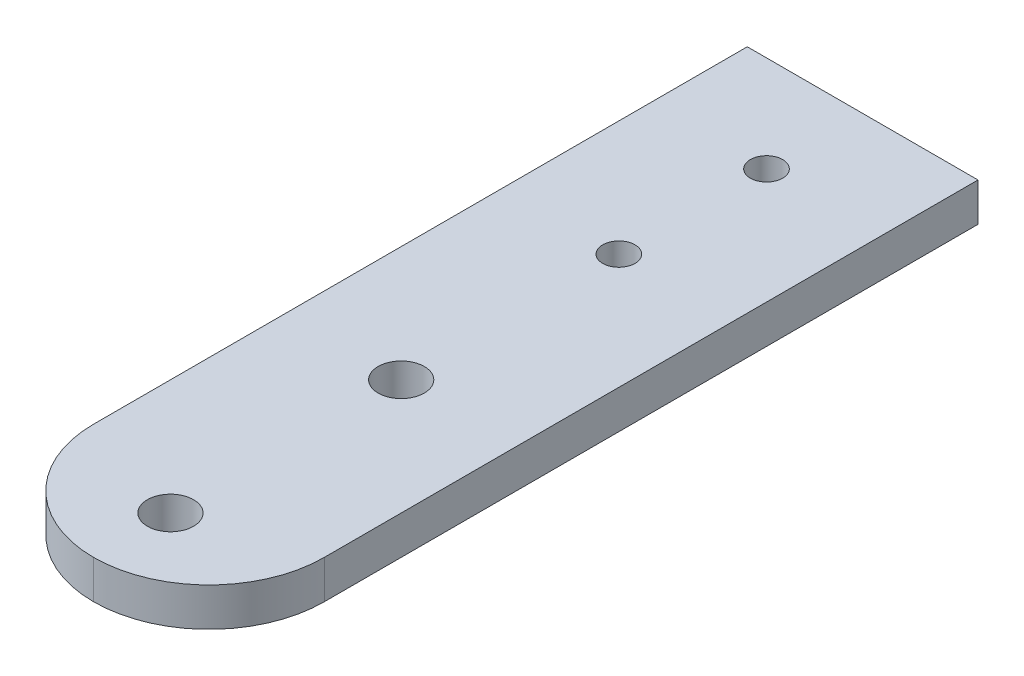
ISO-10303-21;
HEADER;
FILE_DESCRIPTION(('STEP AP214'),'2;1');
FILE_NAME('part.step','',(''),(''),'','','');
FILE_SCHEMA(('AUTOMOTIVE_DESIGN { 1 0 10303 214 1 1 1 1 }'));
ENDSEC;
DATA;
#1=APPLICATION_CONTEXT('core data for automotive mechanical design processes');
#2=APPLICATION_PROTOCOL_DEFINITION('international standard','automotive_design',2000,#1);
#3=PRODUCT_CONTEXT('',#1,'mechanical');
#4=PRODUCT('Part','Part','',(#3));
#5=PRODUCT_RELATED_PRODUCT_CATEGORY('part','',(#4));
#6=PRODUCT_DEFINITION_FORMATION('','',#4);
#7=PRODUCT_DEFINITION_CONTEXT('part definition',#1,'design');
#8=PRODUCT_DEFINITION('design','',#6,#7);
#9=PRODUCT_DEFINITION_SHAPE('','',#8);
#10=(LENGTH_UNIT() NAMED_UNIT(*) SI_UNIT(.MILLI.,.METRE.));
#11=(NAMED_UNIT(*) PLANE_ANGLE_UNIT() SI_UNIT($,.RADIAN.));
#12=(NAMED_UNIT(*) SI_UNIT($,.STERADIAN.) SOLID_ANGLE_UNIT());
#13=UNCERTAINTY_MEASURE_WITH_UNIT(LENGTH_MEASURE(1.E-05),#10,'distance_accuracy_value','');
#14=(GEOMETRIC_REPRESENTATION_CONTEXT(3) GLOBAL_UNCERTAINTY_ASSIGNED_CONTEXT((#13)) GLOBAL_UNIT_ASSIGNED_CONTEXT((#10,
#11,#12)) REPRESENTATION_CONTEXT('',''));
#15=CARTESIAN_POINT('',(0.,0.,0.));
#16=DIRECTION('',(0.,0.,1.));
#17=DIRECTION('',(1.,0.,0.));
#18=AXIS2_PLACEMENT_3D('',#15,#16,#17);
#19=CARTESIAN_POINT('',(7.50000000000002,-1.25,50.));
#20=DIRECTION('',(-1.,0.,0.));
#21=DIRECTION('',(0.,0.,1.));
#22=AXIS2_PLACEMENT_3D('',#19,#20,#21);
#23=PLANE('',#22);
#24=DIRECTION('',(0.,0.,-1.));
#25=VECTOR('',#24,1.);
#26=CARTESIAN_POINT('',(7.50000000000002,1.25,50.));
#27=LINE('',#26,#25);
#28=CARTESIAN_POINT('',(7.50000000000002,1.25,42.5));
#29=VERTEX_POINT('',#28);
#30=CARTESIAN_POINT('',(7.50000000000002,1.25,0.));
#31=VERTEX_POINT('',#30);
#32=EDGE_CURVE('E74',#29,#31,#27,.T.);
#33=ORIENTED_EDGE('',*,*,#32,.F.);
#34=DIRECTION('',(0.,1.,0.));
#35=VECTOR('',#34,1.);
#36=CARTESIAN_POINT('',(7.50000000000002,-1.25,42.5));
#37=LINE('',#36,#35);
#38=CARTESIAN_POINT('',(7.50000000000002,-1.25,42.5));
#39=VERTEX_POINT('',#38);
#40=EDGE_CURVE('E11',#29,#39,#37,.F.);
#41=ORIENTED_EDGE('',*,*,#40,.T.);
#42=DIRECTION('',(0.,0.,-1.));
#43=VECTOR('',#42,1.);
#44=CARTESIAN_POINT('',(7.50000000000002,-1.25,50.));
#45=LINE('',#44,#43);
#46=CARTESIAN_POINT('',(7.50000000000002,-1.25,0.));
#47=VERTEX_POINT('',#46);
#48=EDGE_CURVE('E94',#39,#47,#45,.T.);
#49=ORIENTED_EDGE('',*,*,#48,.T.);
#50=DIRECTION('',(0.,1.,0.));
#51=VECTOR('',#50,1.);
#52=CARTESIAN_POINT('',(7.50000000000002,-1.25,0.));
#53=LINE('',#52,#51);
#54=EDGE_CURVE('E89',#47,#31,#53,.T.);
#55=ORIENTED_EDGE('',*,*,#54,.T.);
#56=EDGE_LOOP('',(#33,#41,#49,#55));
#57=FACE_BOUND('',#56,.T.);
#58=ADVANCED_FACE('F31',(#57),#23,.F.);
#59=CARTESIAN_POINT('',(-7.49999999999998,1.25,50.));
#60=DIRECTION('',(0.,-1.,0.));
#61=DIRECTION('',(0.,0.,-1.));
#62=AXIS2_PLACEMENT_3D('',#59,#60,#61);
#63=PLANE('',#62);
#64=CARTESIAN_POINT('',(0.,1.25,15.8495694215464));
#65=DIRECTION('',(0.,1.,0.));
#66=DIRECTION('',(0.,0.,1.));
#67=AXIS2_PLACEMENT_3D('',#64,#65,#66);
#68=CIRCLE('',#67,1.05);
#69=CARTESIAN_POINT('',(0.,1.25,16.8995694215464));
#70=VERTEX_POINT('',#69);
#71=EDGE_CURVE('E131',#70,#70,#68,.T.);
#72=ORIENTED_EDGE('',*,*,#71,.F.);
#73=EDGE_LOOP('',(#72));
#74=FACE_BOUND('',#73,.T.);
#75=CARTESIAN_POINT('',(0.,1.25,6.24956942154637));
#76=DIRECTION('',(0.,1.,0.));
#77=DIRECTION('',(0.,0.,1.));
#78=AXIS2_PLACEMENT_3D('',#75,#76,#77);
#79=CIRCLE('',#78,1.05);
#80=CARTESIAN_POINT('',(0.,1.25,7.29956942154637));
#81=VERTEX_POINT('',#80);
#82=EDGE_CURVE('E123',#81,#81,#79,.T.);
#83=ORIENTED_EDGE('',*,*,#82,.F.);
#84=EDGE_LOOP('',(#83));
#85=FACE_BOUND('',#84,.T.);
#86=CARTESIAN_POINT('',(0.,1.25,30.));
#87=DIRECTION('',(0.,1.,0.));
#88=DIRECTION('',(0.,0.,1.));
#89=AXIS2_PLACEMENT_3D('',#86,#87,#88);
#90=CIRCLE('',#89,1.5);
#91=CARTESIAN_POINT('',(0.,1.25,31.5));
#92=VERTEX_POINT('',#91);
#93=EDGE_CURVE('E120',#92,#92,#90,.T.);
#94=ORIENTED_EDGE('',*,*,#93,.F.);
#95=EDGE_LOOP('',(#94));
#96=FACE_BOUND('',#95,.T.);
#97=CARTESIAN_POINT('',(0.,1.25,45.));
#98=DIRECTION('',(0.,1.,0.));
#99=DIRECTION('',(0.,0.,1.));
#100=AXIS2_PLACEMENT_3D('',#97,#98,#99);
#101=CIRCLE('',#100,1.5);
#102=CARTESIAN_POINT('',(0.,1.25,46.5));
#103=VERTEX_POINT('',#102);
#104=EDGE_CURVE('E99',#103,#103,#101,.T.);
#105=ORIENTED_EDGE('',*,*,#104,.F.);
#106=EDGE_LOOP('',(#105));
#107=FACE_BOUND('',#106,.T.);
#108=DIRECTION('',(0.,0.,-1.));
#109=VECTOR('',#108,1.);
#110=CARTESIAN_POINT('',(-7.49999999999998,1.25,50.));
#111=LINE('',#110,#109);
#112=CARTESIAN_POINT('',(-7.49999999999998,1.25,42.5));
#113=VERTEX_POINT('',#112);
#114=CARTESIAN_POINT('',(-7.49999999999998,1.25,0.));
#115=VERTEX_POINT('',#114);
#116=EDGE_CURVE('E83',#113,#115,#111,.T.);
#117=ORIENTED_EDGE('',*,*,#116,.F.);
#118=CARTESIAN_POINT('',(0.,1.25,42.5));
#119=DIRECTION('',(0.,-1.,0.));
#120=DIRECTION('',(0.,0.,-1.));
#121=AXIS2_PLACEMENT_3D('',#118,#119,#120);
#122=CIRCLE('',#121,7.5);
#123=CARTESIAN_POINT('',(0.,1.25,50.));
#124=VERTEX_POINT('',#123);
#125=EDGE_CURVE('E40',#113,#124,#122,.F.);
#126=ORIENTED_EDGE('',*,*,#125,.T.);
#127=CARTESIAN_POINT('',(0.,1.25,42.5));
#128=DIRECTION('',(0.,-1.,0.));
#129=DIRECTION('',(0.,0.,-1.));
#130=AXIS2_PLACEMENT_3D('',#127,#128,#129);
#131=CIRCLE('',#130,7.5);
#132=EDGE_CURVE('E48',#124,#29,#131,.F.);
#133=ORIENTED_EDGE('',*,*,#132,.T.);
#134=ORIENTED_EDGE('',*,*,#32,.T.);
#135=DIRECTION('',(-1.,0.,0.));
#136=VECTOR('',#135,1.);
#137=CARTESIAN_POINT('',(-7.49999999999998,1.25,0.));
#138=LINE('',#137,#136);
#139=EDGE_CURVE('E77',#31,#115,#138,.T.);
#140=ORIENTED_EDGE('',*,*,#139,.T.);
#141=EDGE_LOOP('',(#117,#126,#133,#134,#140));
#142=FACE_BOUND('',#141,.T.);
#143=ADVANCED_FACE('F76',(#74,#85,#96,#107,#142),#63,.F.);
#144=CARTESIAN_POINT('',(-7.49999999999998,-1.25,50.));
#145=DIRECTION('',(1.,0.,0.));
#146=DIRECTION('',(0.,0.,-1.));
#147=AXIS2_PLACEMENT_3D('',#144,#145,#146);
#148=PLANE('',#147);
#149=DIRECTION('',(0.,0.,-1.));
#150=VECTOR('',#149,1.);
#151=CARTESIAN_POINT('',(-7.49999999999998,-1.25,50.));
#152=LINE('',#151,#150);
#153=CARTESIAN_POINT('',(-7.49999999999998,-1.25,42.5));
#154=VERTEX_POINT('',#153);
#155=CARTESIAN_POINT('',(-7.49999999999998,-1.25,0.));
#156=VERTEX_POINT('',#155);
#157=EDGE_CURVE('E107',#154,#156,#152,.T.);
#158=ORIENTED_EDGE('',*,*,#157,.F.);
#159=DIRECTION('',(0.,-1.,0.));
#160=VECTOR('',#159,1.);
#161=CARTESIAN_POINT('',(-7.49999999999998,-1.25,42.5));
#162=LINE('',#161,#160);
#163=EDGE_CURVE('E113',#154,#113,#162,.F.);
#164=ORIENTED_EDGE('',*,*,#163,.T.);
#165=ORIENTED_EDGE('',*,*,#116,.T.);
#166=DIRECTION('',(0.,-1.,0.));
#167=VECTOR('',#166,1.);
#168=CARTESIAN_POINT('',(-7.49999999999998,-1.25,0.));
#169=LINE('',#168,#167);
#170=EDGE_CURVE('E91',#115,#156,#169,.T.);
#171=ORIENTED_EDGE('',*,*,#170,.T.);
#172=EDGE_LOOP('',(#158,#164,#165,#171));
#173=FACE_BOUND('',#172,.T.);
#174=ADVANCED_FACE('F144',(#173),#148,.F.);
#175=CARTESIAN_POINT('',(-7.49999999999998,-1.25,50.));
#176=DIRECTION('',(0.,1.,0.));
#177=DIRECTION('',(0.,0.,1.));
#178=AXIS2_PLACEMENT_3D('',#175,#176,#177);
#179=PLANE('',#178);
#180=CARTESIAN_POINT('',(0.,-1.25,15.8495694215464));
#181=DIRECTION('',(0.,1.,0.));
#182=DIRECTION('',(0.,0.,1.));
#183=AXIS2_PLACEMENT_3D('',#180,#181,#182);
#184=CIRCLE('',#183,1.05);
#185=CARTESIAN_POINT('',(0.,-1.25,16.8995694215464));
#186=VERTEX_POINT('',#185);
#187=EDGE_CURVE('E35',#186,#186,#184,.T.);
#188=ORIENTED_EDGE('',*,*,#187,.T.);
#189=EDGE_LOOP('',(#188));
#190=FACE_BOUND('',#189,.T.);
#191=CARTESIAN_POINT('',(0.,-1.25,6.24956942154637));
#192=DIRECTION('',(0.,1.,0.));
#193=DIRECTION('',(0.,0.,1.));
#194=AXIS2_PLACEMENT_3D('',#191,#192,#193);
#195=CIRCLE('',#194,1.05);
#196=CARTESIAN_POINT('',(0.,-1.25,7.29956942154637));
#197=VERTEX_POINT('',#196);
#198=EDGE_CURVE('E121',#197,#197,#195,.T.);
#199=ORIENTED_EDGE('',*,*,#198,.T.);
#200=EDGE_LOOP('',(#199));
#201=FACE_BOUND('',#200,.T.);
#202=CARTESIAN_POINT('',(0.,-1.25,30.));
#203=DIRECTION('',(0.,1.,0.));
#204=DIRECTION('',(0.,0.,1.));
#205=AXIS2_PLACEMENT_3D('',#202,#203,#204);
#206=CIRCLE('',#205,1.5);
#207=CARTESIAN_POINT('',(0.,-1.25,31.5));
#208=VERTEX_POINT('',#207);
#209=EDGE_CURVE('E134',#208,#208,#206,.T.);
#210=ORIENTED_EDGE('',*,*,#209,.T.);
#211=EDGE_LOOP('',(#210));
#212=FACE_BOUND('',#211,.T.);
#213=CARTESIAN_POINT('',(0.,-1.25,45.));
#214=DIRECTION('',(0.,1.,0.));
#215=DIRECTION('',(0.,0.,1.));
#216=AXIS2_PLACEMENT_3D('',#213,#214,#215);
#217=CIRCLE('',#216,1.5);
#218=CARTESIAN_POINT('',(0.,-1.25,46.5));
#219=VERTEX_POINT('',#218);
#220=EDGE_CURVE('E96',#219,#219,#217,.T.);
#221=ORIENTED_EDGE('',*,*,#220,.T.);
#222=EDGE_LOOP('',(#221));
#223=FACE_BOUND('',#222,.T.);
#224=CARTESIAN_POINT('',(0.,-1.25,42.5));
#225=DIRECTION('',(0.,1.,0.));
#226=DIRECTION('',(0.,0.,1.));
#227=AXIS2_PLACEMENT_3D('',#224,#225,#226);
#228=CIRCLE('',#227,7.5);
#229=CARTESIAN_POINT('',(0.,-1.25,50.));
#230=VERTEX_POINT('',#229);
#231=EDGE_CURVE('E82',#39,#230,#228,.F.);
#232=ORIENTED_EDGE('',*,*,#231,.T.);
#233=CARTESIAN_POINT('',(0.,-1.25,42.5));
#234=DIRECTION('',(0.,1.,0.));
#235=DIRECTION('',(0.,0.,1.));
#236=AXIS2_PLACEMENT_3D('',#233,#234,#235);
#237=CIRCLE('',#236,7.5);
#238=EDGE_CURVE('E111',#230,#154,#237,.F.);
#239=ORIENTED_EDGE('',*,*,#238,.T.);
#240=ORIENTED_EDGE('',*,*,#157,.T.);
#241=DIRECTION('',(1.,0.,0.));
#242=VECTOR('',#241,1.);
#243=CARTESIAN_POINT('',(-7.49999999999998,-1.25,0.));
#244=LINE('',#243,#242);
#245=EDGE_CURVE('E104',#156,#47,#244,.T.);
#246=ORIENTED_EDGE('',*,*,#245,.T.);
#247=ORIENTED_EDGE('',*,*,#48,.F.);
#248=EDGE_LOOP('',(#232,#239,#240,#246,#247));
#249=FACE_BOUND('',#248,.T.);
#250=ADVANCED_FACE('F160',(#190,#201,#212,#223,#249),#179,.F.);
#251=CARTESIAN_POINT('',(7.50000000000002,1.25,0.));
#252=DIRECTION('',(0.,0.,-1.));
#253=DIRECTION('',(-1.,0.,0.));
#254=AXIS2_PLACEMENT_3D('',#251,#252,#253);
#255=PLANE('',#254);
#256=ORIENTED_EDGE('',*,*,#54,.F.);
#257=ORIENTED_EDGE('',*,*,#245,.F.);
#258=ORIENTED_EDGE('',*,*,#170,.F.);
#259=ORIENTED_EDGE('',*,*,#139,.F.);
#260=EDGE_LOOP('',(#256,#257,#258,#259));
#261=FACE_BOUND('',#260,.T.);
#262=ADVANCED_FACE('F87',(#261),#255,.T.);
#263=CARTESIAN_POINT('',(0.,-1.25,45.));
#264=DIRECTION('',(0.,1.,0.));
#265=DIRECTION('',(0.,0.,1.));
#266=AXIS2_PLACEMENT_3D('',#263,#264,#265);
#267=CYLINDRICAL_SURFACE('',#266,1.5);
#268=ORIENTED_EDGE('',*,*,#220,.F.);
#269=EDGE_LOOP('',(#268));
#270=FACE_BOUND('',#269,.T.);
#271=ORIENTED_EDGE('',*,*,#104,.T.);
#272=EDGE_LOOP('',(#271));
#273=FACE_BOUND('',#272,.T.);
#274=ADVANCED_FACE('F150',(#270,#273),#267,.F.);
#275=CARTESIAN_POINT('',(0.,-1.25,30.));
#276=DIRECTION('',(0.,1.,0.));
#277=DIRECTION('',(0.,0.,1.));
#278=AXIS2_PLACEMENT_3D('',#275,#276,#277);
#279=CYLINDRICAL_SURFACE('',#278,1.5);
#280=ORIENTED_EDGE('',*,*,#209,.F.);
#281=EDGE_LOOP('',(#280));
#282=FACE_BOUND('',#281,.T.);
#283=ORIENTED_EDGE('',*,*,#93,.T.);
#284=EDGE_LOOP('',(#283));
#285=FACE_BOUND('',#284,.T.);
#286=ADVANCED_FACE('F140',(#282,#285),#279,.F.);
#287=CARTESIAN_POINT('',(0.,1.25,42.5));
#288=DIRECTION('',(0.,1.,0.));
#289=DIRECTION('',(0.,0.,1.));
#290=AXIS2_PLACEMENT_3D('',#287,#288,#289);
#291=CYLINDRICAL_SURFACE('',#290,7.5);
#292=ORIENTED_EDGE('',*,*,#40,.F.);
#293=ORIENTED_EDGE('',*,*,#132,.F.);
#294=DIRECTION('',(0.,1.,0.));
#295=VECTOR('',#294,1.);
#296=CARTESIAN_POINT('',(0.,1.25,50.));
#297=LINE('',#296,#295);
#298=EDGE_CURVE('E118',#230,#124,#297,.T.);
#299=ORIENTED_EDGE('',*,*,#298,.F.);
#300=ORIENTED_EDGE('',*,*,#231,.F.);
#301=EDGE_LOOP('',(#292,#293,#299,#300));
#302=FACE_BOUND('',#301,.T.);
#303=ADVANCED_FACE('F33',(#302),#291,.T.);
#304=CARTESIAN_POINT('',(0.,1.25,42.5));
#305=DIRECTION('',(0.,-1.,0.));
#306=DIRECTION('',(0.,0.,-1.));
#307=AXIS2_PLACEMENT_3D('',#304,#305,#306);
#308=CYLINDRICAL_SURFACE('',#307,7.5);
#309=ORIENTED_EDGE('',*,*,#125,.F.);
#310=ORIENTED_EDGE('',*,*,#163,.F.);
#311=ORIENTED_EDGE('',*,*,#238,.F.);
#312=ORIENTED_EDGE('',*,*,#298,.T.);
#313=EDGE_LOOP('',(#309,#310,#311,#312));
#314=FACE_BOUND('',#313,.T.);
#315=ADVANCED_FACE('F168',(#314),#308,.T.);
#316=CARTESIAN_POINT('',(0.,-8.75,6.24956942154637));
#317=DIRECTION('',(0.,1.,0.));
#318=DIRECTION('',(0.,0.,1.));
#319=AXIS2_PLACEMENT_3D('',#316,#317,#318);
#320=CYLINDRICAL_SURFACE('',#319,1.05);
#321=ORIENTED_EDGE('',*,*,#82,.T.);
#322=EDGE_LOOP('',(#321));
#323=FACE_BOUND('',#322,.T.);
#324=ORIENTED_EDGE('',*,*,#198,.F.);
#325=EDGE_LOOP('',(#324));
#326=FACE_BOUND('',#325,.T.);
#327=ADVANCED_FACE('F170',(#323,#326),#320,.F.);
#328=CARTESIAN_POINT('',(0.,-8.75,15.8495694215464));
#329=DIRECTION('',(0.,1.,0.));
#330=DIRECTION('',(0.,0.,1.));
#331=AXIS2_PLACEMENT_3D('',#328,#329,#330);
#332=CYLINDRICAL_SURFACE('',#331,1.05);
#333=ORIENTED_EDGE('',*,*,#71,.T.);
#334=EDGE_LOOP('',(#333));
#335=FACE_BOUND('',#334,.T.);
#336=ORIENTED_EDGE('',*,*,#187,.F.);
#337=EDGE_LOOP('',(#336));
#338=FACE_BOUND('',#337,.T.);
#339=ADVANCED_FACE('F176',(#335,#338),#332,.F.);
#340=CLOSED_SHELL('',(#58,#143,#174,#250,#262,#274,#286,#303,#315,#327,#339));
#341=MANIFOLD_SOLID_BREP('B2',#340);
#342=ADVANCED_BREP_SHAPE_REPRESENTATION('',(#18,#341),#14);
#343=SHAPE_DEFINITION_REPRESENTATION(#9,#342);
ENDSEC;
END-ISO-10303-21;
